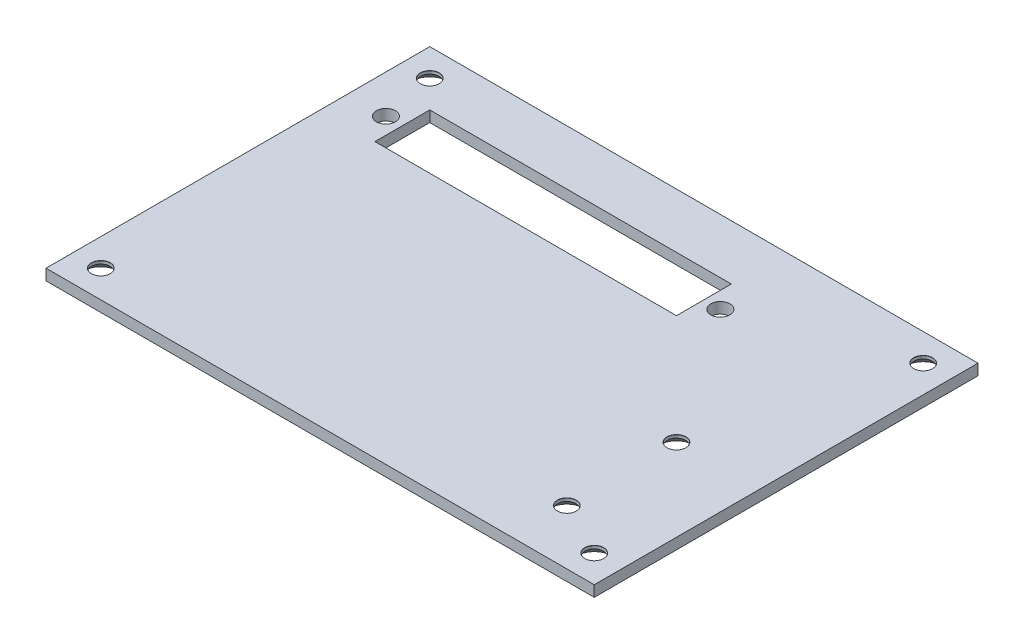
ISO-10303-21;
HEADER;
FILE_DESCRIPTION(('STEP AP214'),'2;1');
FILE_NAME('part.step','',(''),(''),'','','');
FILE_SCHEMA(('AUTOMOTIVE_DESIGN { 1 0 10303 214 1 1 1 1 }'));
ENDSEC;
DATA;
#1=APPLICATION_CONTEXT('core data for automotive mechanical design processes');
#2=APPLICATION_PROTOCOL_DEFINITION('international standard','automotive_design',2000,#1);
#3=PRODUCT_CONTEXT('',#1,'mechanical');
#4=PRODUCT('Part','Part','',(#3));
#5=PRODUCT_RELATED_PRODUCT_CATEGORY('part','',(#4));
#6=PRODUCT_DEFINITION_FORMATION('','',#4);
#7=PRODUCT_DEFINITION_CONTEXT('part definition',#1,'design');
#8=PRODUCT_DEFINITION('design','',#6,#7);
#9=PRODUCT_DEFINITION_SHAPE('','',#8);
#10=(LENGTH_UNIT() NAMED_UNIT(*) SI_UNIT(.MILLI.,.METRE.));
#11=(NAMED_UNIT(*) PLANE_ANGLE_UNIT() SI_UNIT($,.RADIAN.));
#12=(NAMED_UNIT(*) SI_UNIT($,.STERADIAN.) SOLID_ANGLE_UNIT());
#13=UNCERTAINTY_MEASURE_WITH_UNIT(LENGTH_MEASURE(1.E-05),#10,'distance_accuracy_value','');
#14=(GEOMETRIC_REPRESENTATION_CONTEXT(3) GLOBAL_UNCERTAINTY_ASSIGNED_CONTEXT((#13)) GLOBAL_UNIT_ASSIGNED_CONTEXT((#10,
#11,#12)) REPRESENTATION_CONTEXT('',''));
#15=CARTESIAN_POINT('',(0.,0.,0.));
#16=DIRECTION('',(0.,0.,1.));
#17=DIRECTION('',(1.,0.,0.));
#18=AXIS2_PLACEMENT_3D('',#15,#16,#17);
#19=CARTESIAN_POINT('',(0.,2.,0.));
#20=DIRECTION('',(0.,-1.,0.));
#21=DIRECTION('',(0.,0.,-1.));
#22=AXIS2_PLACEMENT_3D('',#19,#20,#21);
#23=PLANE('',#22);
#24=CARTESIAN_POINT('',(85.,2.,-10.));
#25=DIRECTION('',(0.,-1.,0.));
#26=DIRECTION('',(0.,0.,-1.));
#27=AXIS2_PLACEMENT_3D('',#24,#25,#26);
#28=CIRCLE('',#27,1.725);
#29=CARTESIAN_POINT('',(85.,2.,-11.725));
#30=VERTEX_POINT('',#29);
#31=EDGE_CURVE('E336',#30,#30,#28,.T.);
#32=ORIENTED_EDGE('',*,*,#31,.T.);
#33=EDGE_LOOP('',(#32));
#34=FACE_BOUND('',#33,.T.);
#35=CARTESIAN_POINT('',(85.,2.,-30.));
#36=DIRECTION('',(0.,-1.,0.));
#37=DIRECTION('',(0.,0.,-1.));
#38=AXIS2_PLACEMENT_3D('',#35,#36,#37);
#39=CIRCLE('',#38,1.725);
#40=CARTESIAN_POINT('',(85.,2.,-31.725));
#41=VERTEX_POINT('',#40);
#42=EDGE_CURVE('E347',#41,#41,#39,.T.);
#43=ORIENTED_EDGE('',*,*,#42,.T.);
#44=EDGE_LOOP('',(#43));
#45=FACE_BOUND('',#44,.T.);
#46=CARTESIAN_POINT('',(5.,2.,-5.));
#47=DIRECTION('',(0.,-1.,0.));
#48=DIRECTION('',(0.,0.,-1.));
#49=AXIS2_PLACEMENT_3D('',#46,#47,#48);
#50=CIRCLE('',#49,1.725);
#51=CARTESIAN_POINT('',(5.,2.,-6.725));
#52=VERTEX_POINT('',#51);
#53=EDGE_CURVE('E363',#52,#52,#50,.T.);
#54=ORIENTED_EDGE('',*,*,#53,.T.);
#55=EDGE_LOOP('',(#54));
#56=FACE_BOUND('',#55,.T.);
#57=CARTESIAN_POINT('',(95.,2.,-5.));
#58=DIRECTION('',(0.,-1.,0.));
#59=DIRECTION('',(0.,0.,-1.));
#60=AXIS2_PLACEMENT_3D('',#57,#58,#59);
#61=CIRCLE('',#60,1.725);
#62=CARTESIAN_POINT('',(95.,2.,-6.725));
#63=VERTEX_POINT('',#62);
#64=EDGE_CURVE('E379',#63,#63,#61,.T.);
#65=ORIENTED_EDGE('',*,*,#64,.T.);
#66=EDGE_LOOP('',(#65));
#67=FACE_BOUND('',#66,.T.);
#68=CARTESIAN_POINT('',(95.,2.,-65.));
#69=DIRECTION('',(0.,-1.,0.));
#70=DIRECTION('',(0.,0.,-1.));
#71=AXIS2_PLACEMENT_3D('',#68,#69,#70);
#72=CIRCLE('',#71,1.725);
#73=CARTESIAN_POINT('',(95.,2.,-66.725));
#74=VERTEX_POINT('',#73);
#75=EDGE_CURVE('E395',#74,#74,#72,.T.);
#76=ORIENTED_EDGE('',*,*,#75,.T.);
#77=EDGE_LOOP('',(#76));
#78=FACE_BOUND('',#77,.T.);
#79=CARTESIAN_POINT('',(5.,2.,-65.));
#80=DIRECTION('',(0.,-1.,0.));
#81=DIRECTION('',(0.,0.,-1.));
#82=AXIS2_PLACEMENT_3D('',#79,#80,#81);
#83=CIRCLE('',#82,1.725);
#84=CARTESIAN_POINT('',(5.,2.,-66.725));
#85=VERTEX_POINT('',#84);
#86=EDGE_CURVE('E411',#85,#85,#83,.T.);
#87=ORIENTED_EDGE('',*,*,#86,.T.);
#88=EDGE_LOOP('',(#87));
#89=FACE_BOUND('',#88,.T.);
#90=CARTESIAN_POINT('',(68.,2.,-55.));
#91=DIRECTION('',(0.,1.,0.));
#92=DIRECTION('',(0.,0.,1.));
#93=AXIS2_PLACEMENT_3D('',#90,#91,#92);
#94=CIRCLE('',#93,1.74999999999999);
#95=CARTESIAN_POINT('',(68.,2.,-53.25));
#96=VERTEX_POINT('',#95);
#97=EDGE_CURVE('E435',#96,#96,#94,.T.);
#98=ORIENTED_EDGE('',*,*,#97,.F.);
#99=EDGE_LOOP('',(#98));
#100=FACE_BOUND('',#99,.T.);
#101=DIRECTION('',(0.,0.,1.));
#102=VECTOR('',#101,1.);
#103=CARTESIAN_POINT('',(0.,2.,0.));
#104=LINE('',#103,#102);
#105=CARTESIAN_POINT('',(0.,2.,-70.));
#106=VERTEX_POINT('',#105);
#107=CARTESIAN_POINT('',(0.,2.,0.));
#108=VERTEX_POINT('',#107);
#109=EDGE_CURVE('E156',#106,#108,#104,.T.);
#110=ORIENTED_EDGE('',*,*,#109,.T.);
#111=DIRECTION('',(1.,0.,0.));
#112=VECTOR('',#111,1.);
#113=CARTESIAN_POINT('',(0.,2.,0.));
#114=LINE('',#113,#112);
#115=CARTESIAN_POINT('',(100.,2.,0.));
#116=VERTEX_POINT('',#115);
#117=EDGE_CURVE('E160',#108,#116,#114,.T.);
#118=ORIENTED_EDGE('',*,*,#117,.T.);
#119=DIRECTION('',(0.,0.,-1.));
#120=VECTOR('',#119,1.);
#121=CARTESIAN_POINT('',(100.,2.,0.));
#122=LINE('',#121,#120);
#123=CARTESIAN_POINT('',(100.,2.,-70.));
#124=VERTEX_POINT('',#123);
#125=EDGE_CURVE('E164',#116,#124,#122,.T.);
#126=ORIENTED_EDGE('',*,*,#125,.T.);
#127=DIRECTION('',(-1.,0.,0.));
#128=VECTOR('',#127,1.);
#129=CARTESIAN_POINT('',(0.,2.,-70.));
#130=LINE('',#129,#128);
#131=EDGE_CURVE('E167',#124,#106,#130,.T.);
#132=ORIENTED_EDGE('',*,*,#131,.T.);
#133=EDGE_LOOP('',(#110,#118,#126,#132));
#134=FACE_BOUND('',#133,.T.);
#135=DIRECTION('',(0.,0.,1.));
#136=VECTOR('',#135,1.);
#137=CARTESIAN_POINT('',(10.,2.,-60.));
#138=LINE('',#137,#136);
#139=CARTESIAN_POINT('',(10.,2.,-60.));
#140=VERTEX_POINT('',#139);
#141=CARTESIAN_POINT('',(10.,2.,-50.));
#142=VERTEX_POINT('',#141);
#143=EDGE_CURVE('E105',#140,#142,#138,.T.);
#144=ORIENTED_EDGE('',*,*,#143,.F.);
#145=DIRECTION('',(-1.,0.,0.));
#146=VECTOR('',#145,1.);
#147=CARTESIAN_POINT('',(10.,2.,-60.));
#148=LINE('',#147,#146);
#149=CARTESIAN_POINT('',(65.,2.,-60.));
#150=VERTEX_POINT('',#149);
#151=EDGE_CURVE('E132',#150,#140,#148,.T.);
#152=ORIENTED_EDGE('',*,*,#151,.F.);
#153=DIRECTION('',(0.,0.,-1.));
#154=VECTOR('',#153,1.);
#155=CARTESIAN_POINT('',(65.,2.,-60.));
#156=LINE('',#155,#154);
#157=CARTESIAN_POINT('',(65.,2.,-50.));
#158=VERTEX_POINT('',#157);
#159=EDGE_CURVE('E128',#158,#150,#156,.T.);
#160=ORIENTED_EDGE('',*,*,#159,.F.);
#161=DIRECTION('',(1.,0.,0.));
#162=VECTOR('',#161,1.);
#163=CARTESIAN_POINT('',(10.,2.,-50.));
#164=LINE('',#163,#162);
#165=EDGE_CURVE('E114',#142,#158,#164,.T.);
#166=ORIENTED_EDGE('',*,*,#165,.F.);
#167=EDGE_LOOP('',(#144,#152,#160,#166));
#168=FACE_BOUND('',#167,.T.);
#169=CARTESIAN_POINT('',(7.00000000000001,2.,-55.));
#170=DIRECTION('',(0.,1.,0.));
#171=DIRECTION('',(0.,0.,1.));
#172=AXIS2_PLACEMENT_3D('',#169,#170,#171);
#173=CIRCLE('',#172,1.74999999999999);
#174=CARTESIAN_POINT('',(7.00000000000001,2.,-53.25));
#175=VERTEX_POINT('',#174);
#176=EDGE_CURVE('E427',#175,#175,#173,.T.);
#177=ORIENTED_EDGE('',*,*,#176,.F.);
#178=EDGE_LOOP('',(#177));
#179=FACE_BOUND('',#178,.T.);
#180=ADVANCED_FACE('F39',(#34,#45,#56,#67,#78,#89,#100,#134,#168,#179),#23,.F.);
#181=CARTESIAN_POINT('',(0.,0.,0.));
#182=DIRECTION('',(0.,-1.,0.));
#183=DIRECTION('',(0.,0.,-1.));
#184=AXIS2_PLACEMENT_3D('',#181,#182,#183);
#185=PLANE('',#184);
#186=CARTESIAN_POINT('',(85.,0.,-10.));
#187=DIRECTION('',(0.,-1.,0.));
#188=DIRECTION('',(0.,0.,-1.));
#189=AXIS2_PLACEMENT_3D('',#186,#187,#188);
#190=CIRCLE('',#189,3.15);
#191=CARTESIAN_POINT('',(85.,0.,-13.15));
#192=VERTEX_POINT('',#191);
#193=EDGE_CURVE('E334',#192,#192,#190,.T.);
#194=ORIENTED_EDGE('',*,*,#193,.F.);
#195=EDGE_LOOP('',(#194));
#196=FACE_BOUND('',#195,.T.);
#197=CARTESIAN_POINT('',(85.,0.,-30.));
#198=DIRECTION('',(0.,-1.,0.));
#199=DIRECTION('',(0.,0.,-1.));
#200=AXIS2_PLACEMENT_3D('',#197,#198,#199);
#201=CIRCLE('',#200,3.15);
#202=CARTESIAN_POINT('',(85.,0.,-33.15));
#203=VERTEX_POINT('',#202);
#204=EDGE_CURVE('E351',#203,#203,#201,.T.);
#205=ORIENTED_EDGE('',*,*,#204,.F.);
#206=EDGE_LOOP('',(#205));
#207=FACE_BOUND('',#206,.T.);
#208=CARTESIAN_POINT('',(5.,0.,-5.));
#209=DIRECTION('',(0.,-1.,0.));
#210=DIRECTION('',(0.,0.,-1.));
#211=AXIS2_PLACEMENT_3D('',#208,#209,#210);
#212=CIRCLE('',#211,3.15);
#213=CARTESIAN_POINT('',(5.,0.,-8.15));
#214=VERTEX_POINT('',#213);
#215=EDGE_CURVE('E367',#214,#214,#212,.T.);
#216=ORIENTED_EDGE('',*,*,#215,.F.);
#217=EDGE_LOOP('',(#216));
#218=FACE_BOUND('',#217,.T.);
#219=CARTESIAN_POINT('',(95.,0.,-5.));
#220=DIRECTION('',(0.,-1.,0.));
#221=DIRECTION('',(0.,0.,-1.));
#222=AXIS2_PLACEMENT_3D('',#219,#220,#221);
#223=CIRCLE('',#222,3.15);
#224=CARTESIAN_POINT('',(95.,0.,-8.15));
#225=VERTEX_POINT('',#224);
#226=EDGE_CURVE('E383',#225,#225,#223,.T.);
#227=ORIENTED_EDGE('',*,*,#226,.F.);
#228=EDGE_LOOP('',(#227));
#229=FACE_BOUND('',#228,.T.);
#230=CARTESIAN_POINT('',(95.,0.,-65.));
#231=DIRECTION('',(0.,-1.,0.));
#232=DIRECTION('',(0.,0.,-1.));
#233=AXIS2_PLACEMENT_3D('',#230,#231,#232);
#234=CIRCLE('',#233,3.15);
#235=CARTESIAN_POINT('',(95.,0.,-68.15));
#236=VERTEX_POINT('',#235);
#237=EDGE_CURVE('E399',#236,#236,#234,.T.);
#238=ORIENTED_EDGE('',*,*,#237,.F.);
#239=EDGE_LOOP('',(#238));
#240=FACE_BOUND('',#239,.T.);
#241=CARTESIAN_POINT('',(5.,0.,-65.));
#242=DIRECTION('',(0.,-1.,0.));
#243=DIRECTION('',(0.,0.,-1.));
#244=AXIS2_PLACEMENT_3D('',#241,#242,#243);
#245=CIRCLE('',#244,3.15);
#246=CARTESIAN_POINT('',(5.,0.,-68.15));
#247=VERTEX_POINT('',#246);
#248=EDGE_CURVE('E415',#247,#247,#245,.T.);
#249=ORIENTED_EDGE('',*,*,#248,.F.);
#250=EDGE_LOOP('',(#249));
#251=FACE_BOUND('',#250,.T.);
#252=CARTESIAN_POINT('',(7.00000000000001,0.,-55.));
#253=DIRECTION('',(0.,-1.,0.));
#254=DIRECTION('',(0.,0.,-1.));
#255=AXIS2_PLACEMENT_3D('',#252,#253,#254);
#256=CIRCLE('',#255,1.74999999999999);
#257=CARTESIAN_POINT('',(7.00000000000001,0.,-56.75));
#258=VERTEX_POINT('',#257);
#259=EDGE_CURVE('E431',#258,#258,#256,.T.);
#260=ORIENTED_EDGE('',*,*,#259,.F.);
#261=EDGE_LOOP('',(#260));
#262=FACE_BOUND('',#261,.T.);
#263=CARTESIAN_POINT('',(68.,0.,-55.));
#264=DIRECTION('',(0.,-1.,0.));
#265=DIRECTION('',(0.,0.,-1.));
#266=AXIS2_PLACEMENT_3D('',#263,#264,#265);
#267=CIRCLE('',#266,1.74999999999999);
#268=CARTESIAN_POINT('',(68.,0.,-56.75));
#269=VERTEX_POINT('',#268);
#270=EDGE_CURVE('E140',#269,#269,#267,.T.);
#271=ORIENTED_EDGE('',*,*,#270,.F.);
#272=EDGE_LOOP('',(#271));
#273=FACE_BOUND('',#272,.T.);
#274=DIRECTION('',(0.,0.,1.));
#275=VECTOR('',#274,1.);
#276=CARTESIAN_POINT('',(0.,0.,0.));
#277=LINE('',#276,#275);
#278=CARTESIAN_POINT('',(0.,0.,-70.));
#279=VERTEX_POINT('',#278);
#280=CARTESIAN_POINT('',(0.,0.,0.));
#281=VERTEX_POINT('',#280);
#282=EDGE_CURVE('E123',#279,#281,#277,.T.);
#283=ORIENTED_EDGE('',*,*,#282,.F.);
#284=DIRECTION('',(-1.,0.,0.));
#285=VECTOR('',#284,1.);
#286=CARTESIAN_POINT('',(0.,0.,-70.));
#287=LINE('',#286,#285);
#288=CARTESIAN_POINT('',(100.,0.,-70.));
#289=VERTEX_POINT('',#288);
#290=EDGE_CURVE('E161',#289,#279,#287,.T.);
#291=ORIENTED_EDGE('',*,*,#290,.F.);
#292=DIRECTION('',(0.,0.,-1.));
#293=VECTOR('',#292,1.);
#294=CARTESIAN_POINT('',(100.,0.,0.));
#295=LINE('',#294,#293);
#296=CARTESIAN_POINT('',(100.,0.,0.));
#297=VERTEX_POINT('',#296);
#298=EDGE_CURVE('E177',#297,#289,#295,.T.);
#299=ORIENTED_EDGE('',*,*,#298,.F.);
#300=DIRECTION('',(1.,0.,0.));
#301=VECTOR('',#300,1.);
#302=CARTESIAN_POINT('',(0.,0.,0.));
#303=LINE('',#302,#301);
#304=EDGE_CURVE('E174',#281,#297,#303,.T.);
#305=ORIENTED_EDGE('',*,*,#304,.F.);
#306=EDGE_LOOP('',(#283,#291,#299,#305));
#307=FACE_BOUND('',#306,.T.);
#308=DIRECTION('',(-1.,0.,0.));
#309=VECTOR('',#308,1.);
#310=CARTESIAN_POINT('',(10.,0.,-60.));
#311=LINE('',#310,#309);
#312=CARTESIAN_POINT('',(65.,0.,-60.));
#313=VERTEX_POINT('',#312);
#314=CARTESIAN_POINT('',(10.,0.,-60.));
#315=VERTEX_POINT('',#314);
#316=EDGE_CURVE('E115',#313,#315,#311,.T.);
#317=ORIENTED_EDGE('',*,*,#316,.T.);
#318=DIRECTION('',(0.,0.,1.));
#319=VECTOR('',#318,1.);
#320=CARTESIAN_POINT('',(10.,0.,-60.));
#321=LINE('',#320,#319);
#322=CARTESIAN_POINT('',(10.,0.,-50.));
#323=VERTEX_POINT('',#322);
#324=EDGE_CURVE('E63',#315,#323,#321,.T.);
#325=ORIENTED_EDGE('',*,*,#324,.T.);
#326=DIRECTION('',(1.,0.,0.));
#327=VECTOR('',#326,1.);
#328=CARTESIAN_POINT('',(10.,0.,-50.));
#329=LINE('',#328,#327);
#330=CARTESIAN_POINT('',(65.,0.,-50.));
#331=VERTEX_POINT('',#330);
#332=EDGE_CURVE('E121',#323,#331,#329,.T.);
#333=ORIENTED_EDGE('',*,*,#332,.T.);
#334=DIRECTION('',(0.,0.,-1.));
#335=VECTOR('',#334,1.);
#336=CARTESIAN_POINT('',(65.,0.,-60.));
#337=LINE('',#336,#335);
#338=EDGE_CURVE('E143',#331,#313,#337,.T.);
#339=ORIENTED_EDGE('',*,*,#338,.T.);
#340=EDGE_LOOP('',(#317,#325,#333,#339));
#341=FACE_BOUND('',#340,.T.);
#342=ADVANCED_FACE('F200',(#196,#207,#218,#229,#240,#251,#262,#273,#307,#341),#185,.T.);
#343=CARTESIAN_POINT('',(0.,2.,0.));
#344=DIRECTION('',(1.,0.,0.));
#345=DIRECTION('',(0.,0.,-1.));
#346=AXIS2_PLACEMENT_3D('',#343,#344,#345);
#347=PLANE('',#346);
#348=ORIENTED_EDGE('',*,*,#282,.T.);
#349=DIRECTION('',(0.,-1.,0.));
#350=VECTOR('',#349,1.);
#351=CARTESIAN_POINT('',(0.,2.,0.));
#352=LINE('',#351,#350);
#353=EDGE_CURVE('E11',#108,#281,#352,.T.);
#354=ORIENTED_EDGE('',*,*,#353,.F.);
#355=ORIENTED_EDGE('',*,*,#109,.F.);
#356=DIRECTION('',(0.,-1.,0.));
#357=VECTOR('',#356,1.);
#358=CARTESIAN_POINT('',(0.,2.,-70.));
#359=LINE('',#358,#357);
#360=EDGE_CURVE('E170',#106,#279,#359,.T.);
#361=ORIENTED_EDGE('',*,*,#360,.T.);
#362=EDGE_LOOP('',(#348,#354,#355,#361));
#363=FACE_BOUND('',#362,.T.);
#364=ADVANCED_FACE('F41',(#363),#347,.F.);
#365=CARTESIAN_POINT('',(0.,2.,0.));
#366=DIRECTION('',(0.,0.,-1.));
#367=DIRECTION('',(-1.,0.,0.));
#368=AXIS2_PLACEMENT_3D('',#365,#366,#367);
#369=PLANE('',#368);
#370=ORIENTED_EDGE('',*,*,#304,.T.);
#371=DIRECTION('',(0.,-1.,0.));
#372=VECTOR('',#371,1.);
#373=CARTESIAN_POINT('',(100.,2.,0.));
#374=LINE('',#373,#372);
#375=EDGE_CURVE('E48',#116,#297,#374,.T.);
#376=ORIENTED_EDGE('',*,*,#375,.F.);
#377=ORIENTED_EDGE('',*,*,#117,.F.);
#378=ORIENTED_EDGE('',*,*,#353,.T.);
#379=EDGE_LOOP('',(#370,#376,#377,#378));
#380=FACE_BOUND('',#379,.T.);
#381=ADVANCED_FACE('F210',(#380),#369,.F.);
#382=CARTESIAN_POINT('',(100.,2.,0.));
#383=DIRECTION('',(-1.,0.,0.));
#384=DIRECTION('',(0.,0.,1.));
#385=AXIS2_PLACEMENT_3D('',#382,#383,#384);
#386=PLANE('',#385);
#387=ORIENTED_EDGE('',*,*,#298,.T.);
#388=DIRECTION('',(0.,-1.,0.));
#389=VECTOR('',#388,1.);
#390=CARTESIAN_POINT('',(100.,2.,-70.));
#391=LINE('',#390,#389);
#392=EDGE_CURVE('E185',#124,#289,#391,.T.);
#393=ORIENTED_EDGE('',*,*,#392,.F.);
#394=ORIENTED_EDGE('',*,*,#125,.F.);
#395=ORIENTED_EDGE('',*,*,#375,.T.);
#396=EDGE_LOOP('',(#387,#393,#394,#395));
#397=FACE_BOUND('',#396,.T.);
#398=ADVANCED_FACE('F194',(#397),#386,.F.);
#399=CARTESIAN_POINT('',(0.,2.,-70.));
#400=DIRECTION('',(0.,0.,1.));
#401=DIRECTION('',(1.,0.,0.));
#402=AXIS2_PLACEMENT_3D('',#399,#400,#401);
#403=PLANE('',#402);
#404=ORIENTED_EDGE('',*,*,#290,.T.);
#405=ORIENTED_EDGE('',*,*,#360,.F.);
#406=ORIENTED_EDGE('',*,*,#131,.F.);
#407=ORIENTED_EDGE('',*,*,#392,.T.);
#408=EDGE_LOOP('',(#404,#405,#406,#407));
#409=FACE_BOUND('',#408,.T.);
#410=ADVANCED_FACE('F204',(#409),#403,.F.);
#411=CARTESIAN_POINT('',(10.,2.,-60.));
#412=DIRECTION('',(1.,0.,0.));
#413=DIRECTION('',(0.,0.,-1.));
#414=AXIS2_PLACEMENT_3D('',#411,#412,#413);
#415=PLANE('',#414);
#416=ORIENTED_EDGE('',*,*,#324,.F.);
#417=DIRECTION('',(0.,-1.,0.));
#418=VECTOR('',#417,1.);
#419=CARTESIAN_POINT('',(10.,2.,-60.));
#420=LINE('',#419,#418);
#421=EDGE_CURVE('E109',#140,#315,#420,.T.);
#422=ORIENTED_EDGE('',*,*,#421,.F.);
#423=ORIENTED_EDGE('',*,*,#143,.T.);
#424=DIRECTION('',(0.,-1.,0.));
#425=VECTOR('',#424,1.);
#426=CARTESIAN_POINT('',(10.,2.,-50.));
#427=LINE('',#426,#425);
#428=EDGE_CURVE('E108',#142,#323,#427,.T.);
#429=ORIENTED_EDGE('',*,*,#428,.T.);
#430=EDGE_LOOP('',(#416,#422,#423,#429));
#431=FACE_BOUND('',#430,.T.);
#432=ADVANCED_FACE('F107',(#431),#415,.T.);
#433=CARTESIAN_POINT('',(10.,2.,-50.));
#434=DIRECTION('',(0.,0.,-1.));
#435=DIRECTION('',(-1.,0.,0.));
#436=AXIS2_PLACEMENT_3D('',#433,#434,#435);
#437=PLANE('',#436);
#438=ORIENTED_EDGE('',*,*,#332,.F.);
#439=ORIENTED_EDGE('',*,*,#428,.F.);
#440=ORIENTED_EDGE('',*,*,#165,.T.);
#441=DIRECTION('',(0.,-1.,0.));
#442=VECTOR('',#441,1.);
#443=CARTESIAN_POINT('',(65.,2.,-50.));
#444=LINE('',#443,#442);
#445=EDGE_CURVE('E124',#158,#331,#444,.T.);
#446=ORIENTED_EDGE('',*,*,#445,.T.);
#447=EDGE_LOOP('',(#438,#439,#440,#446));
#448=FACE_BOUND('',#447,.T.);
#449=ADVANCED_FACE('F118',(#448),#437,.T.);
#450=CARTESIAN_POINT('',(65.,2.,-60.));
#451=DIRECTION('',(-1.,0.,0.));
#452=DIRECTION('',(0.,0.,1.));
#453=AXIS2_PLACEMENT_3D('',#450,#451,#452);
#454=PLANE('',#453);
#455=ORIENTED_EDGE('',*,*,#338,.F.);
#456=ORIENTED_EDGE('',*,*,#445,.F.);
#457=ORIENTED_EDGE('',*,*,#159,.T.);
#458=DIRECTION('',(0.,-1.,0.));
#459=VECTOR('',#458,1.);
#460=CARTESIAN_POINT('',(65.,2.,-60.));
#461=LINE('',#460,#459);
#462=EDGE_CURVE('E55',#150,#313,#461,.T.);
#463=ORIENTED_EDGE('',*,*,#462,.T.);
#464=EDGE_LOOP('',(#455,#456,#457,#463));
#465=FACE_BOUND('',#464,.T.);
#466=ADVANCED_FACE('F237',(#465),#454,.T.);
#467=CARTESIAN_POINT('',(10.,2.,-60.));
#468=DIRECTION('',(0.,0.,1.));
#469=DIRECTION('',(1.,0.,0.));
#470=AXIS2_PLACEMENT_3D('',#467,#468,#469);
#471=PLANE('',#470);
#472=ORIENTED_EDGE('',*,*,#316,.F.);
#473=ORIENTED_EDGE('',*,*,#462,.F.);
#474=ORIENTED_EDGE('',*,*,#151,.T.);
#475=ORIENTED_EDGE('',*,*,#421,.T.);
#476=EDGE_LOOP('',(#472,#473,#474,#475));
#477=FACE_BOUND('',#476,.T.);
#478=ADVANCED_FACE('F241',(#477),#471,.T.);
#479=CARTESIAN_POINT('',(68.,2.,-55.));
#480=DIRECTION('',(0.,1.,0.));
#481=DIRECTION('',(0.,0.,1.));
#482=AXIS2_PLACEMENT_3D('',#479,#480,#481);
#483=CYLINDRICAL_SURFACE('',#482,1.74999999999999);
#484=ORIENTED_EDGE('',*,*,#97,.T.);
#485=EDGE_LOOP('',(#484));
#486=FACE_BOUND('',#485,.T.);
#487=ORIENTED_EDGE('',*,*,#270,.T.);
#488=EDGE_LOOP('',(#487));
#489=FACE_BOUND('',#488,.T.);
#490=ADVANCED_FACE('F247',(#486,#489),#483,.F.);
#491=CARTESIAN_POINT('',(7.00000000000001,2.,-55.));
#492=DIRECTION('',(0.,1.,0.));
#493=DIRECTION('',(0.,0.,1.));
#494=AXIS2_PLACEMENT_3D('',#491,#492,#493);
#495=CYLINDRICAL_SURFACE('',#494,1.74999999999999);
#496=ORIENTED_EDGE('',*,*,#176,.T.);
#497=EDGE_LOOP('',(#496));
#498=FACE_BOUND('',#497,.T.);
#499=ORIENTED_EDGE('',*,*,#259,.T.);
#500=EDGE_LOOP('',(#499));
#501=FACE_BOUND('',#500,.T.);
#502=ADVANCED_FACE('F250',(#498,#501),#495,.F.);
#503=CARTESIAN_POINT('',(5.,1.97499999999998,-65.));
#504=DIRECTION('',(0.,1.,0.));
#505=DIRECTION('',(0.,0.,1.));
#506=AXIS2_PLACEMENT_3D('',#503,#504,#505);
#507=CONICAL_SURFACE('',#506,1.69999999999999,0.785398163397171);
#508=ORIENTED_EDGE('',*,*,#86,.F.);
#509=EDGE_LOOP('',(#508));
#510=FACE_BOUND('',#509,.T.);
#511=CARTESIAN_POINT('',(5.,1.97499999999998,-65.));
#512=DIRECTION('',(0.,-1.,0.));
#513=DIRECTION('',(0.,0.,-1.));
#514=AXIS2_PLACEMENT_3D('',#511,#512,#513);
#515=CIRCLE('',#514,1.69999999999999);
#516=CARTESIAN_POINT('',(5.,1.97499999999998,-66.7));
#517=VERTEX_POINT('',#516);
#518=EDGE_CURVE('E423',#517,#517,#515,.T.);
#519=ORIENTED_EDGE('',*,*,#518,.T.);
#520=EDGE_LOOP('',(#519));
#521=FACE_BOUND('',#520,.T.);
#522=ADVANCED_FACE('F254',(#510,#521),#507,.F.);
#523=CARTESIAN_POINT('',(5.,0.,-65.));
#524=DIRECTION('',(0.,-1.,0.));
#525=DIRECTION('',(0.,0.,-1.));
#526=AXIS2_PLACEMENT_3D('',#523,#524,#525);
#527=CYLINDRICAL_SURFACE('',#526,1.69999999999999);
#528=ORIENTED_EDGE('',*,*,#518,.F.);
#529=EDGE_LOOP('',(#528));
#530=FACE_BOUND('',#529,.T.);
#531=CARTESIAN_POINT('',(5.,1.45000000000001,-65.));
#532=DIRECTION('',(0.,-1.,0.));
#533=DIRECTION('',(0.,0.,-1.));
#534=AXIS2_PLACEMENT_3D('',#531,#532,#533);
#535=CIRCLE('',#534,1.69999999999999);
#536=CARTESIAN_POINT('',(5.,1.45000000000001,-66.7));
#537=VERTEX_POINT('',#536);
#538=EDGE_CURVE('E419',#537,#537,#535,.T.);
#539=ORIENTED_EDGE('',*,*,#538,.T.);
#540=EDGE_LOOP('',(#539));
#541=FACE_BOUND('',#540,.T.);
#542=ADVANCED_FACE('F258',(#530,#541),#527,.F.);
#543=CARTESIAN_POINT('',(5.,0.,-65.));
#544=DIRECTION('',(0.,-1.,0.));
#545=DIRECTION('',(0.,0.,-1.));
#546=AXIS2_PLACEMENT_3D('',#543,#544,#545);
#547=CONICAL_SURFACE('',#546,3.15,0.78539816339745);
#548=ORIENTED_EDGE('',*,*,#538,.F.);
#549=EDGE_LOOP('',(#548));
#550=FACE_BOUND('',#549,.T.);
#551=ORIENTED_EDGE('',*,*,#248,.T.);
#552=EDGE_LOOP('',(#551));
#553=FACE_BOUND('',#552,.T.);
#554=ADVANCED_FACE('F262',(#550,#553),#547,.F.);
#555=CARTESIAN_POINT('',(95.,1.97499999999998,-65.));
#556=DIRECTION('',(0.,1.,0.));
#557=DIRECTION('',(0.,0.,1.));
#558=AXIS2_PLACEMENT_3D('',#555,#556,#557);
#559=CONICAL_SURFACE('',#558,1.69999999999999,0.785398163397171);
#560=ORIENTED_EDGE('',*,*,#75,.F.);
#561=EDGE_LOOP('',(#560));
#562=FACE_BOUND('',#561,.T.);
#563=CARTESIAN_POINT('',(95.,1.97499999999998,-65.));
#564=DIRECTION('',(0.,-1.,0.));
#565=DIRECTION('',(0.,0.,-1.));
#566=AXIS2_PLACEMENT_3D('',#563,#564,#565);
#567=CIRCLE('',#566,1.69999999999999);
#568=CARTESIAN_POINT('',(95.,1.97499999999998,-66.7));
#569=VERTEX_POINT('',#568);
#570=EDGE_CURVE('E407',#569,#569,#567,.T.);
#571=ORIENTED_EDGE('',*,*,#570,.T.);
#572=EDGE_LOOP('',(#571));
#573=FACE_BOUND('',#572,.T.);
#574=ADVANCED_FACE('F266',(#562,#573),#559,.F.);
#575=CARTESIAN_POINT('',(95.,0.,-65.));
#576=DIRECTION('',(0.,-1.,0.));
#577=DIRECTION('',(0.,0.,-1.));
#578=AXIS2_PLACEMENT_3D('',#575,#576,#577);
#579=CYLINDRICAL_SURFACE('',#578,1.69999999999999);
#580=ORIENTED_EDGE('',*,*,#570,.F.);
#581=EDGE_LOOP('',(#580));
#582=FACE_BOUND('',#581,.T.);
#583=CARTESIAN_POINT('',(95.,1.45000000000001,-65.));
#584=DIRECTION('',(0.,-1.,0.));
#585=DIRECTION('',(0.,0.,-1.));
#586=AXIS2_PLACEMENT_3D('',#583,#584,#585);
#587=CIRCLE('',#586,1.69999999999999);
#588=CARTESIAN_POINT('',(95.,1.45000000000001,-66.7));
#589=VERTEX_POINT('',#588);
#590=EDGE_CURVE('E403',#589,#589,#587,.T.);
#591=ORIENTED_EDGE('',*,*,#590,.T.);
#592=EDGE_LOOP('',(#591));
#593=FACE_BOUND('',#592,.T.);
#594=ADVANCED_FACE('F270',(#582,#593),#579,.F.);
#595=CARTESIAN_POINT('',(95.,0.,-65.));
#596=DIRECTION('',(0.,-1.,0.));
#597=DIRECTION('',(0.,0.,-1.));
#598=AXIS2_PLACEMENT_3D('',#595,#596,#597);
#599=CONICAL_SURFACE('',#598,3.15,0.785398163397448);
#600=ORIENTED_EDGE('',*,*,#590,.F.);
#601=EDGE_LOOP('',(#600));
#602=FACE_BOUND('',#601,.T.);
#603=ORIENTED_EDGE('',*,*,#237,.T.);
#604=EDGE_LOOP('',(#603));
#605=FACE_BOUND('',#604,.T.);
#606=ADVANCED_FACE('F274',(#602,#605),#599,.F.);
#607=CARTESIAN_POINT('',(95.,1.97499999999998,-5.));
#608=DIRECTION('',(0.,1.,0.));
#609=DIRECTION('',(0.,0.,1.));
#610=AXIS2_PLACEMENT_3D('',#607,#608,#609);
#611=CONICAL_SURFACE('',#610,1.69999999999999,0.785398163397171);
#612=ORIENTED_EDGE('',*,*,#64,.F.);
#613=EDGE_LOOP('',(#612));
#614=FACE_BOUND('',#613,.T.);
#615=CARTESIAN_POINT('',(95.,1.97499999999998,-5.));
#616=DIRECTION('',(0.,-1.,0.));
#617=DIRECTION('',(0.,0.,-1.));
#618=AXIS2_PLACEMENT_3D('',#615,#616,#617);
#619=CIRCLE('',#618,1.69999999999999);
#620=CARTESIAN_POINT('',(95.,1.97499999999998,-6.69999999999999));
#621=VERTEX_POINT('',#620);
#622=EDGE_CURVE('E391',#621,#621,#619,.T.);
#623=ORIENTED_EDGE('',*,*,#622,.T.);
#624=EDGE_LOOP('',(#623));
#625=FACE_BOUND('',#624,.T.);
#626=ADVANCED_FACE('F278',(#614,#625),#611,.F.);
#627=CARTESIAN_POINT('',(95.,0.,-5.));
#628=DIRECTION('',(0.,-1.,0.));
#629=DIRECTION('',(0.,0.,-1.));
#630=AXIS2_PLACEMENT_3D('',#627,#628,#629);
#631=CYLINDRICAL_SURFACE('',#630,1.69999999999999);
#632=ORIENTED_EDGE('',*,*,#622,.F.);
#633=EDGE_LOOP('',(#632));
#634=FACE_BOUND('',#633,.T.);
#635=CARTESIAN_POINT('',(95.,1.45000000000001,-5.));
#636=DIRECTION('',(0.,-1.,0.));
#637=DIRECTION('',(0.,0.,-1.));
#638=AXIS2_PLACEMENT_3D('',#635,#636,#637);
#639=CIRCLE('',#638,1.69999999999999);
#640=CARTESIAN_POINT('',(95.,1.45000000000001,-6.69999999999999));
#641=VERTEX_POINT('',#640);
#642=EDGE_CURVE('E387',#641,#641,#639,.T.);
#643=ORIENTED_EDGE('',*,*,#642,.T.);
#644=EDGE_LOOP('',(#643));
#645=FACE_BOUND('',#644,.T.);
#646=ADVANCED_FACE('F282',(#634,#645),#631,.F.);
#647=CARTESIAN_POINT('',(95.,0.,-5.));
#648=DIRECTION('',(0.,-1.,0.));
#649=DIRECTION('',(0.,0.,-1.));
#650=AXIS2_PLACEMENT_3D('',#647,#648,#649);
#651=CONICAL_SURFACE('',#650,3.15,0.785398163397448);
#652=ORIENTED_EDGE('',*,*,#642,.F.);
#653=EDGE_LOOP('',(#652));
#654=FACE_BOUND('',#653,.T.);
#655=ORIENTED_EDGE('',*,*,#226,.T.);
#656=EDGE_LOOP('',(#655));
#657=FACE_BOUND('',#656,.T.);
#658=ADVANCED_FACE('F286',(#654,#657),#651,.F.);
#659=CARTESIAN_POINT('',(5.,1.97499999999998,-5.));
#660=DIRECTION('',(0.,1.,0.));
#661=DIRECTION('',(0.,0.,1.));
#662=AXIS2_PLACEMENT_3D('',#659,#660,#661);
#663=CONICAL_SURFACE('',#662,1.69999999999999,0.785398163397171);
#664=ORIENTED_EDGE('',*,*,#53,.F.);
#665=EDGE_LOOP('',(#664));
#666=FACE_BOUND('',#665,.T.);
#667=CARTESIAN_POINT('',(5.,1.97499999999998,-5.));
#668=DIRECTION('',(0.,-1.,0.));
#669=DIRECTION('',(0.,0.,-1.));
#670=AXIS2_PLACEMENT_3D('',#667,#668,#669);
#671=CIRCLE('',#670,1.69999999999999);
#672=CARTESIAN_POINT('',(5.,1.97499999999998,-6.69999999999999));
#673=VERTEX_POINT('',#672);
#674=EDGE_CURVE('E375',#673,#673,#671,.T.);
#675=ORIENTED_EDGE('',*,*,#674,.T.);
#676=EDGE_LOOP('',(#675));
#677=FACE_BOUND('',#676,.T.);
#678=ADVANCED_FACE('F290',(#666,#677),#663,.F.);
#679=CARTESIAN_POINT('',(5.,0.,-5.));
#680=DIRECTION('',(0.,-1.,0.));
#681=DIRECTION('',(0.,0.,-1.));
#682=AXIS2_PLACEMENT_3D('',#679,#680,#681);
#683=CYLINDRICAL_SURFACE('',#682,1.69999999999999);
#684=ORIENTED_EDGE('',*,*,#674,.F.);
#685=EDGE_LOOP('',(#684));
#686=FACE_BOUND('',#685,.T.);
#687=CARTESIAN_POINT('',(5.,1.45000000000001,-5.));
#688=DIRECTION('',(0.,-1.,0.));
#689=DIRECTION('',(0.,0.,-1.));
#690=AXIS2_PLACEMENT_3D('',#687,#688,#689);
#691=CIRCLE('',#690,1.69999999999999);
#692=CARTESIAN_POINT('',(5.,1.45000000000001,-6.69999999999999));
#693=VERTEX_POINT('',#692);
#694=EDGE_CURVE('E371',#693,#693,#691,.T.);
#695=ORIENTED_EDGE('',*,*,#694,.T.);
#696=EDGE_LOOP('',(#695));
#697=FACE_BOUND('',#696,.T.);
#698=ADVANCED_FACE('F294',(#686,#697),#683,.F.);
#699=CARTESIAN_POINT('',(5.,0.,-5.));
#700=DIRECTION('',(0.,-1.,0.));
#701=DIRECTION('',(0.,0.,-1.));
#702=AXIS2_PLACEMENT_3D('',#699,#700,#701);
#703=CONICAL_SURFACE('',#702,3.15,0.78539816339745);
#704=ORIENTED_EDGE('',*,*,#694,.F.);
#705=EDGE_LOOP('',(#704));
#706=FACE_BOUND('',#705,.T.);
#707=ORIENTED_EDGE('',*,*,#215,.T.);
#708=EDGE_LOOP('',(#707));
#709=FACE_BOUND('',#708,.T.);
#710=ADVANCED_FACE('F298',(#706,#709),#703,.F.);
#711=CARTESIAN_POINT('',(85.,1.97499999999998,-30.));
#712=DIRECTION('',(0.,1.,0.));
#713=DIRECTION('',(0.,0.,1.));
#714=AXIS2_PLACEMENT_3D('',#711,#712,#713);
#715=CONICAL_SURFACE('',#714,1.69999999999999,0.785398163397171);
#716=ORIENTED_EDGE('',*,*,#42,.F.);
#717=EDGE_LOOP('',(#716));
#718=FACE_BOUND('',#717,.T.);
#719=CARTESIAN_POINT('',(85.,1.97499999999998,-30.));
#720=DIRECTION('',(0.,-1.,0.));
#721=DIRECTION('',(0.,0.,-1.));
#722=AXIS2_PLACEMENT_3D('',#719,#720,#721);
#723=CIRCLE('',#722,1.69999999999999);
#724=CARTESIAN_POINT('',(85.,1.97499999999998,-31.7));
#725=VERTEX_POINT('',#724);
#726=EDGE_CURVE('E359',#725,#725,#723,.T.);
#727=ORIENTED_EDGE('',*,*,#726,.T.);
#728=EDGE_LOOP('',(#727));
#729=FACE_BOUND('',#728,.T.);
#730=ADVANCED_FACE('F302',(#718,#729),#715,.F.);
#731=CARTESIAN_POINT('',(85.,0.,-30.));
#732=DIRECTION('',(0.,-1.,0.));
#733=DIRECTION('',(0.,0.,-1.));
#734=AXIS2_PLACEMENT_3D('',#731,#732,#733);
#735=CYLINDRICAL_SURFACE('',#734,1.69999999999999);
#736=ORIENTED_EDGE('',*,*,#726,.F.);
#737=EDGE_LOOP('',(#736));
#738=FACE_BOUND('',#737,.T.);
#739=CARTESIAN_POINT('',(85.,1.45000000000001,-30.));
#740=DIRECTION('',(0.,-1.,0.));
#741=DIRECTION('',(0.,0.,-1.));
#742=AXIS2_PLACEMENT_3D('',#739,#740,#741);
#743=CIRCLE('',#742,1.69999999999999);
#744=CARTESIAN_POINT('',(85.,1.45000000000001,-31.7));
#745=VERTEX_POINT('',#744);
#746=EDGE_CURVE('E355',#745,#745,#743,.T.);
#747=ORIENTED_EDGE('',*,*,#746,.T.);
#748=EDGE_LOOP('',(#747));
#749=FACE_BOUND('',#748,.T.);
#750=ADVANCED_FACE('F306',(#738,#749),#735,.F.);
#751=CARTESIAN_POINT('',(85.,0.,-30.));
#752=DIRECTION('',(0.,-1.,0.));
#753=DIRECTION('',(0.,0.,-1.));
#754=AXIS2_PLACEMENT_3D('',#751,#752,#753);
#755=CONICAL_SURFACE('',#754,3.15,0.785398163397448);
#756=ORIENTED_EDGE('',*,*,#746,.F.);
#757=EDGE_LOOP('',(#756));
#758=FACE_BOUND('',#757,.T.);
#759=ORIENTED_EDGE('',*,*,#204,.T.);
#760=EDGE_LOOP('',(#759));
#761=FACE_BOUND('',#760,.T.);
#762=ADVANCED_FACE('F310',(#758,#761),#755,.F.);
#763=CARTESIAN_POINT('',(85.,1.97499999999998,-10.));
#764=DIRECTION('',(0.,1.,0.));
#765=DIRECTION('',(0.,0.,1.));
#766=AXIS2_PLACEMENT_3D('',#763,#764,#765);
#767=CONICAL_SURFACE('',#766,1.69999999999999,0.785398163397171);
#768=ORIENTED_EDGE('',*,*,#31,.F.);
#769=EDGE_LOOP('',(#768));
#770=FACE_BOUND('',#769,.T.);
#771=CARTESIAN_POINT('',(85.,1.97499999999998,-10.));
#772=DIRECTION('',(0.,-1.,0.));
#773=DIRECTION('',(0.,0.,-1.));
#774=AXIS2_PLACEMENT_3D('',#771,#772,#773);
#775=CIRCLE('',#774,1.69999999999999);
#776=CARTESIAN_POINT('',(85.,1.97499999999998,-11.7));
#777=VERTEX_POINT('',#776);
#778=EDGE_CURVE('E340',#777,#777,#775,.T.);
#779=ORIENTED_EDGE('',*,*,#778,.T.);
#780=EDGE_LOOP('',(#779));
#781=FACE_BOUND('',#780,.T.);
#782=ADVANCED_FACE('F314',(#770,#781),#767,.F.);
#783=CARTESIAN_POINT('',(85.,0.,-10.));
#784=DIRECTION('',(0.,-1.,0.));
#785=DIRECTION('',(0.,0.,-1.));
#786=AXIS2_PLACEMENT_3D('',#783,#784,#785);
#787=CYLINDRICAL_SURFACE('',#786,1.69999999999999);
#788=ORIENTED_EDGE('',*,*,#778,.F.);
#789=EDGE_LOOP('',(#788));
#790=FACE_BOUND('',#789,.T.);
#791=CARTESIAN_POINT('',(85.,1.45000000000001,-10.));
#792=DIRECTION('',(0.,-1.,0.));
#793=DIRECTION('',(0.,0.,-1.));
#794=AXIS2_PLACEMENT_3D('',#791,#792,#793);
#795=CIRCLE('',#794,1.69999999999999);
#796=CARTESIAN_POINT('',(85.,1.45000000000001,-11.7));
#797=VERTEX_POINT('',#796);
#798=EDGE_CURVE('E331',#797,#797,#795,.T.);
#799=ORIENTED_EDGE('',*,*,#798,.T.);
#800=EDGE_LOOP('',(#799));
#801=FACE_BOUND('',#800,.T.);
#802=ADVANCED_FACE('F318',(#790,#801),#787,.F.);
#803=CARTESIAN_POINT('',(85.,0.,-10.));
#804=DIRECTION('',(0.,-1.,0.));
#805=DIRECTION('',(0.,0.,-1.));
#806=AXIS2_PLACEMENT_3D('',#803,#804,#805);
#807=CONICAL_SURFACE('',#806,3.15,0.785398163397448);
#808=ORIENTED_EDGE('',*,*,#798,.F.);
#809=EDGE_LOOP('',(#808));
#810=FACE_BOUND('',#809,.T.);
#811=ORIENTED_EDGE('',*,*,#193,.T.);
#812=EDGE_LOOP('',(#811));
#813=FACE_BOUND('',#812,.T.);
#814=ADVANCED_FACE('F322',(#810,#813),#807,.F.);
#815=CLOSED_SHELL('',(#180,#342,#364,#381,#398,#410,#432,#449,#466,#478,#490,#502,#522,#542,
#554,#574,#594,#606,#626,#646,#658,#678,#698,#710,#730,#750,#762,#782,#802,#814));
#816=MANIFOLD_SOLID_BREP('B2',#815);
#817=ADVANCED_BREP_SHAPE_REPRESENTATION('',(#18,#816),#14);
#818=SHAPE_DEFINITION_REPRESENTATION(#9,#817);
ENDSEC;
END-ISO-10303-21;
